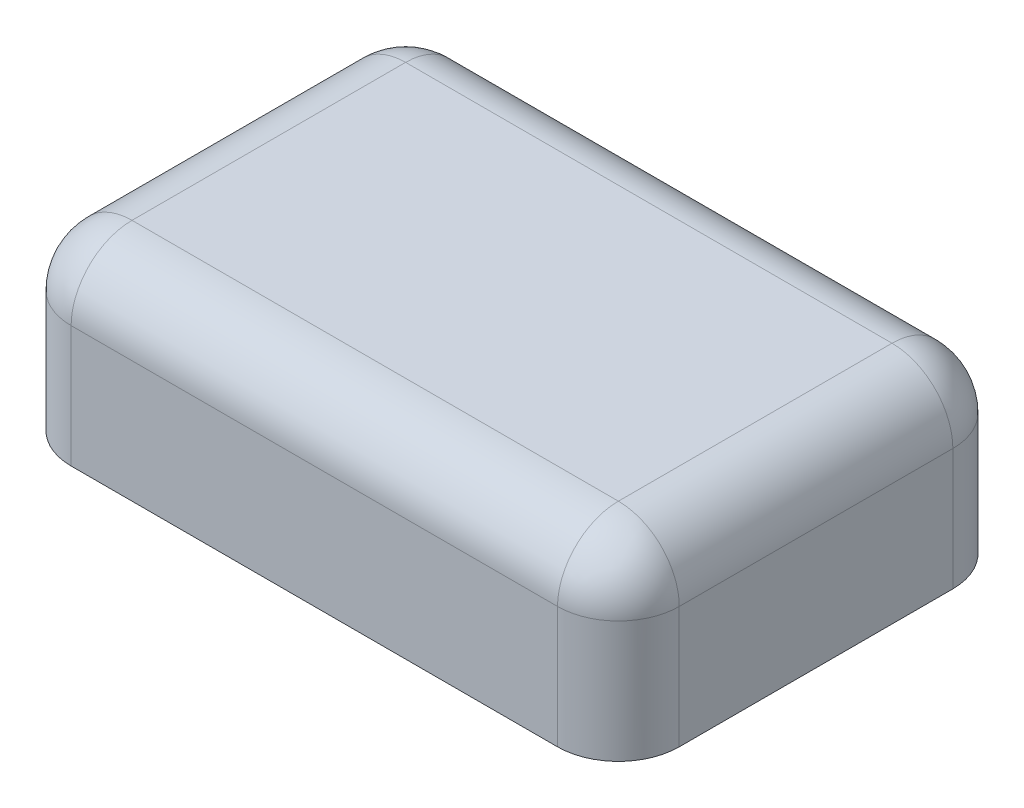
ISO-10303-21;
HEADER;
FILE_DESCRIPTION(('STEP AP214'),'2;1');
FILE_NAME('part.step','',(''),(''),'','','');
FILE_SCHEMA(('AUTOMOTIVE_DESIGN { 1 0 10303 214 1 1 1 1 }'));
ENDSEC;
DATA;
#1=APPLICATION_CONTEXT('core data for automotive mechanical design processes');
#2=APPLICATION_PROTOCOL_DEFINITION('international standard','automotive_design',2000,#1);
#3=PRODUCT_CONTEXT('',#1,'mechanical');
#4=PRODUCT('Part','Part','',(#3));
#5=PRODUCT_RELATED_PRODUCT_CATEGORY('part','',(#4));
#6=PRODUCT_DEFINITION_FORMATION('','',#4);
#7=PRODUCT_DEFINITION_CONTEXT('part definition',#1,'design');
#8=PRODUCT_DEFINITION('design','',#6,#7);
#9=PRODUCT_DEFINITION_SHAPE('','',#8);
#10=(LENGTH_UNIT() NAMED_UNIT(*) SI_UNIT(.MILLI.,.METRE.));
#11=(NAMED_UNIT(*) PLANE_ANGLE_UNIT() SI_UNIT($,.RADIAN.));
#12=(NAMED_UNIT(*) SI_UNIT($,.STERADIAN.) SOLID_ANGLE_UNIT());
#13=UNCERTAINTY_MEASURE_WITH_UNIT(LENGTH_MEASURE(1.E-05),#10,'distance_accuracy_value','');
#14=(GEOMETRIC_REPRESENTATION_CONTEXT(3) GLOBAL_UNCERTAINTY_ASSIGNED_CONTEXT((#13)) GLOBAL_UNIT_ASSIGNED_CONTEXT((#10,
#11,#12)) REPRESENTATION_CONTEXT('',''));
#15=CARTESIAN_POINT('',(0.,0.,0.));
#16=DIRECTION('',(0.,0.,1.));
#17=DIRECTION('',(1.,0.,0.));
#18=AXIS2_PLACEMENT_3D('',#15,#16,#17);
#19=CARTESIAN_POINT('',(0.,0.3,0.));
#20=DIRECTION('',(0.,1.,0.));
#21=DIRECTION('',(0.,0.,1.));
#22=AXIS2_PLACEMENT_3D('',#19,#20,#21);
#23=PLANE('',#22);
#24=DIRECTION('',(-1.,0.,0.));
#25=VECTOR('',#24,1.);
#26=CARTESIAN_POINT('',(0.553768,0.3,-0.225));
#27=LINE('',#26,#25);
#28=CARTESIAN_POINT('',(-0.4,0.3,-0.225));
#29=VERTEX_POINT('',#28);
#30=CARTESIAN_POINT('',(0.4,0.3,-0.22499999995655));
#31=VERTEX_POINT('',#30);
#32=EDGE_CURVE('E88',#29,#31,#27,.F.);
#33=ORIENTED_EDGE('',*,*,#32,.F.);
#34=DIRECTION('',(0.,0.,1.));
#35=VECTOR('',#34,1.);
#36=CARTESIAN_POINT('',(-0.4,0.3,-0.378768));
#37=LINE('',#36,#35);
#38=CARTESIAN_POINT('',(-0.4,0.3,0.22499999995655));
#39=VERTEX_POINT('',#38);
#40=EDGE_CURVE('E85',#39,#29,#37,.F.);
#41=ORIENTED_EDGE('',*,*,#40,.F.);
#42=DIRECTION('',(1.,0.,0.));
#43=VECTOR('',#42,1.);
#44=CARTESIAN_POINT('',(-0.553768,0.3,0.225));
#45=LINE('',#44,#43);
#46=CARTESIAN_POINT('',(0.39999999995655,0.3,0.225));
#47=VERTEX_POINT('',#46);
#48=EDGE_CURVE('E75',#47,#39,#45,.F.);
#49=ORIENTED_EDGE('',*,*,#48,.F.);
#50=DIRECTION('',(0.,0.,-1.));
#51=VECTOR('',#50,1.);
#52=CARTESIAN_POINT('',(0.4,0.3,0.378768));
#53=LINE('',#52,#51);
#54=EDGE_CURVE('E182',#31,#47,#53,.F.);
#55=ORIENTED_EDGE('',*,*,#54,.F.);
#56=EDGE_LOOP('',(#33,#41,#49,#55));
#57=FACE_BOUND('',#56,.T.);
#58=ADVANCED_FACE('F16',(#57),#23,.T.);
#59=CARTESIAN_POINT('',(-0.4,0.2,0.225));
#60=DIRECTION('',(-0.707106832991096,0.,0.707106729381996));
#61=DIRECTION('',(0.,1.,0.));
#62=AXIS2_PLACEMENT_3D('',#59,#60,#61);
#63=SPHERICAL_SURFACE('',#62,0.1);
#64=CARTESIAN_POINT('',(-0.4,0.2,0.225));
#65=DIRECTION('',(0.,-1.,0.));
#66=DIRECTION('',(0.,0.,-1.));
#67=AXIS2_PLACEMENT_3D('',#64,#65,#66);
#68=CIRCLE('',#67,0.1);
#69=CARTESIAN_POINT('',(-0.47071068329911,0.2,0.2957106729382));
#70=VERTEX_POINT('',#69);
#71=CARTESIAN_POINT('',(-0.5,0.2,0.22499999995655));
#72=VERTEX_POINT('',#71);
#73=EDGE_CURVE('E104',#70,#72,#68,.T.);
#74=ORIENTED_EDGE('',*,*,#73,.F.);
#75=CARTESIAN_POINT('',(-0.4,0.2,0.225));
#76=DIRECTION('',(0.,-1.,0.));
#77=DIRECTION('',(0.,0.,-1.));
#78=AXIS2_PLACEMENT_3D('',#75,#76,#77);
#79=CIRCLE('',#78,0.1);
#80=CARTESIAN_POINT('',(-0.4,0.2,0.325));
#81=VERTEX_POINT('',#80);
#82=EDGE_CURVE('E34',#81,#70,#79,.T.);
#83=ORIENTED_EDGE('',*,*,#82,.F.);
#84=CARTESIAN_POINT('',(-0.4,0.2,0.225));
#85=DIRECTION('',(1.,0.,0.));
#86=DIRECTION('',(0.,0.,-1.));
#87=AXIS2_PLACEMENT_3D('',#84,#85,#86);
#88=CIRCLE('',#87,0.1);
#89=EDGE_CURVE('E19',#39,#81,#88,.T.);
#90=ORIENTED_EDGE('',*,*,#89,.F.);
#91=CARTESIAN_POINT('',(-0.4,0.2,0.2249999999131));
#92=DIRECTION('',(0.,0.,1.));
#93=DIRECTION('',(1.,0.,0.));
#94=AXIS2_PLACEMENT_3D('',#91,#92,#93);
#95=CIRCLE('',#94,0.1);
#96=EDGE_CURVE('E92',#72,#39,#95,.F.);
#97=ORIENTED_EDGE('',*,*,#96,.F.);
#98=EDGE_LOOP('',(#74,#83,#90,#97));
#99=FACE_BOUND('',#98,.T.);
#100=ADVANCED_FACE('F102',(#99),#63,.T.);
#101=CARTESIAN_POINT('',(-0.553768,0.2,0.225));
#102=DIRECTION('',(1.,0.,0.));
#103=DIRECTION('',(0.,0.,-1.));
#104=AXIS2_PLACEMENT_3D('',#101,#102,#103);
#105=CYLINDRICAL_SURFACE('',#104,0.1);
#106=CARTESIAN_POINT('',(0.3999999999131,0.2,0.225));
#107=DIRECTION('',(1.,0.,0.));
#108=DIRECTION('',(0.,0.,-1.));
#109=AXIS2_PLACEMENT_3D('',#106,#107,#108);
#110=CIRCLE('',#109,0.1);
#111=CARTESIAN_POINT('',(0.39999999995655,0.2,0.325));
#112=VERTEX_POINT('',#111);
#113=EDGE_CURVE('E80',#47,#112,#110,.T.);
#114=ORIENTED_EDGE('',*,*,#113,.F.);
#115=ORIENTED_EDGE('',*,*,#48,.T.);
#116=ORIENTED_EDGE('',*,*,#89,.T.);
#117=DIRECTION('',(1.,0.,0.));
#118=VECTOR('',#117,1.);
#119=CARTESIAN_POINT('',(-0.5,0.2,0.325));
#120=LINE('',#119,#118);
#121=EDGE_CURVE('E109',#112,#81,#120,.F.);
#122=ORIENTED_EDGE('',*,*,#121,.F.);
#123=EDGE_LOOP('',(#114,#115,#116,#122));
#124=FACE_BOUND('',#123,.T.);
#125=ADVANCED_FACE('F77',(#124),#105,.T.);
#126=CARTESIAN_POINT('',(0.4,0.2,0.225));
#127=DIRECTION('',(0.707106729381996,0.,0.707106832991096));
#128=DIRECTION('',(0.,1.,0.));
#129=AXIS2_PLACEMENT_3D('',#126,#127,#128);
#130=SPHERICAL_SURFACE('',#129,0.1);
#131=CARTESIAN_POINT('',(0.4,0.2,0.225));
#132=DIRECTION('',(0.,-1.,0.));
#133=DIRECTION('',(0.,0.,-1.));
#134=AXIS2_PLACEMENT_3D('',#131,#132,#133);
#135=CIRCLE('',#134,0.1);
#136=CARTESIAN_POINT('',(0.4707106729382,0.2,0.29571068329911));
#137=VERTEX_POINT('',#136);
#138=EDGE_CURVE('E168',#137,#112,#135,.T.);
#139=ORIENTED_EDGE('',*,*,#138,.F.);
#140=CARTESIAN_POINT('',(0.4,0.2,0.225));
#141=DIRECTION('',(0.,-1.,0.));
#142=DIRECTION('',(0.,0.,-1.));
#143=AXIS2_PLACEMENT_3D('',#140,#141,#142);
#144=CIRCLE('',#143,0.1);
#145=CARTESIAN_POINT('',(0.5,0.2,0.225));
#146=VERTEX_POINT('',#145);
#147=EDGE_CURVE('E166',#146,#137,#144,.T.);
#148=ORIENTED_EDGE('',*,*,#147,.F.);
#149=CARTESIAN_POINT('',(0.4,0.2,0.225));
#150=DIRECTION('',(0.,0.,-1.));
#151=DIRECTION('',(-1.,0.,0.));
#152=AXIS2_PLACEMENT_3D('',#149,#150,#151);
#153=CIRCLE('',#152,0.1);
#154=EDGE_CURVE('E184',#47,#146,#153,.T.);
#155=ORIENTED_EDGE('',*,*,#154,.F.);
#156=ORIENTED_EDGE('',*,*,#113,.T.);
#157=EDGE_LOOP('',(#139,#148,#155,#156));
#158=FACE_BOUND('',#157,.T.);
#159=ADVANCED_FACE('F171',(#158),#130,.T.);
#160=CARTESIAN_POINT('',(0.4,0.2,0.378768));
#161=DIRECTION('',(0.,0.,-1.));
#162=DIRECTION('',(-1.,0.,0.));
#163=AXIS2_PLACEMENT_3D('',#160,#161,#162);
#164=CYLINDRICAL_SURFACE('',#163,0.1);
#165=CARTESIAN_POINT('',(0.4,0.2,-0.2249999999131));
#166=DIRECTION('',(0.,0.,-1.));
#167=DIRECTION('',(-1.,0.,0.));
#168=AXIS2_PLACEMENT_3D('',#165,#166,#167);
#169=CIRCLE('',#168,0.1);
#170=CARTESIAN_POINT('',(0.5,0.2,-0.22499999995655));
#171=VERTEX_POINT('',#170);
#172=EDGE_CURVE('E183',#31,#171,#169,.T.);
#173=ORIENTED_EDGE('',*,*,#172,.F.);
#174=ORIENTED_EDGE('',*,*,#54,.T.);
#175=ORIENTED_EDGE('',*,*,#154,.T.);
#176=DIRECTION('',(0.,0.,-1.));
#177=VECTOR('',#176,1.);
#178=CARTESIAN_POINT('',(0.5,0.2,0.325));
#179=LINE('',#178,#177);
#180=EDGE_CURVE('E161',#171,#146,#179,.F.);
#181=ORIENTED_EDGE('',*,*,#180,.F.);
#182=EDGE_LOOP('',(#173,#174,#175,#181));
#183=FACE_BOUND('',#182,.T.);
#184=ADVANCED_FACE('F155',(#183),#164,.T.);
#185=CARTESIAN_POINT('',(0.4,0.2,-0.225));
#186=DIRECTION('',(0.707106832991096,0.,-0.707106729381996));
#187=DIRECTION('',(0.,1.,0.));
#188=AXIS2_PLACEMENT_3D('',#185,#186,#187);
#189=SPHERICAL_SURFACE('',#188,0.1);
#190=CARTESIAN_POINT('',(0.4,0.2,-0.225));
#191=DIRECTION('',(0.,-1.,0.));
#192=DIRECTION('',(0.,0.,-1.));
#193=AXIS2_PLACEMENT_3D('',#190,#191,#192);
#194=CIRCLE('',#193,0.1);
#195=CARTESIAN_POINT('',(0.47071068329911,0.2,-0.2957106729382));
#196=VERTEX_POINT('',#195);
#197=EDGE_CURVE('E201',#196,#171,#194,.T.);
#198=ORIENTED_EDGE('',*,*,#197,.F.);
#199=CARTESIAN_POINT('',(0.4,0.2,-0.225));
#200=DIRECTION('',(0.,-1.,0.));
#201=DIRECTION('',(0.,0.,-1.));
#202=AXIS2_PLACEMENT_3D('',#199,#200,#201);
#203=CIRCLE('',#202,0.1);
#204=CARTESIAN_POINT('',(0.4,0.2,-0.325));
#205=VERTEX_POINT('',#204);
#206=EDGE_CURVE('E160',#205,#196,#203,.T.);
#207=ORIENTED_EDGE('',*,*,#206,.F.);
#208=CARTESIAN_POINT('',(0.4,0.2,-0.225));
#209=DIRECTION('',(-1.,0.,0.));
#210=DIRECTION('',(0.,0.,1.));
#211=AXIS2_PLACEMENT_3D('',#208,#209,#210);
#212=CIRCLE('',#211,0.1);
#213=EDGE_CURVE('E181',#31,#205,#212,.T.);
#214=ORIENTED_EDGE('',*,*,#213,.F.);
#215=ORIENTED_EDGE('',*,*,#172,.T.);
#216=EDGE_LOOP('',(#198,#207,#214,#215));
#217=FACE_BOUND('',#216,.T.);
#218=ADVANCED_FACE('F150',(#217),#189,.T.);
#219=CARTESIAN_POINT('',(0.553768,0.2,-0.225));
#220=DIRECTION('',(-1.,0.,0.));
#221=DIRECTION('',(0.,0.,1.));
#222=AXIS2_PLACEMENT_3D('',#219,#220,#221);
#223=CYLINDRICAL_SURFACE('',#222,0.1);
#224=CARTESIAN_POINT('',(-0.4,0.2,-0.225));
#225=DIRECTION('',(-1.,0.,0.));
#226=DIRECTION('',(0.,0.,1.));
#227=AXIS2_PLACEMENT_3D('',#224,#225,#226);
#228=CIRCLE('',#227,0.1);
#229=CARTESIAN_POINT('',(-0.4,0.2,-0.325));
#230=VERTEX_POINT('',#229);
#231=EDGE_CURVE('E180',#29,#230,#228,.T.);
#232=ORIENTED_EDGE('',*,*,#231,.F.);
#233=ORIENTED_EDGE('',*,*,#32,.T.);
#234=ORIENTED_EDGE('',*,*,#213,.T.);
#235=DIRECTION('',(-1.,0.,0.));
#236=VECTOR('',#235,1.);
#237=CARTESIAN_POINT('',(0.5,0.2,-0.325));
#238=LINE('',#237,#236);
#239=EDGE_CURVE('E138',#230,#205,#238,.F.);
#240=ORIENTED_EDGE('',*,*,#239,.F.);
#241=EDGE_LOOP('',(#232,#233,#234,#240));
#242=FACE_BOUND('',#241,.T.);
#243=ADVANCED_FACE('F145',(#242),#223,.T.);
#244=CARTESIAN_POINT('',(-0.4,0.2,-0.225));
#245=DIRECTION('',(-0.707106729381996,0.,-0.707106832991096));
#246=DIRECTION('',(0.,1.,0.));
#247=AXIS2_PLACEMENT_3D('',#244,#245,#246);
#248=SPHERICAL_SURFACE('',#247,0.1);
#249=CARTESIAN_POINT('',(-0.4,0.2,-0.225));
#250=DIRECTION('',(0.,-1.,0.));
#251=DIRECTION('',(0.,0.,-1.));
#252=AXIS2_PLACEMENT_3D('',#249,#250,#251);
#253=CIRCLE('',#252,0.1);
#254=CARTESIAN_POINT('',(-0.4707106729382,0.2,-0.29571068329911));
#255=VERTEX_POINT('',#254);
#256=EDGE_CURVE('E134',#255,#230,#253,.T.);
#257=ORIENTED_EDGE('',*,*,#256,.F.);
#258=CARTESIAN_POINT('',(-0.4,0.2,-0.225));
#259=DIRECTION('',(0.,-1.,0.));
#260=DIRECTION('',(0.,0.,-1.));
#261=AXIS2_PLACEMENT_3D('',#258,#259,#260);
#262=CIRCLE('',#261,0.1);
#263=CARTESIAN_POINT('',(-0.5,0.2,-0.225));
#264=VERTEX_POINT('',#263);
#265=EDGE_CURVE('E131',#264,#255,#262,.T.);
#266=ORIENTED_EDGE('',*,*,#265,.F.);
#267=CARTESIAN_POINT('',(-0.4,0.2,-0.225));
#268=DIRECTION('',(0.,0.,1.));
#269=DIRECTION('',(1.,0.,0.));
#270=AXIS2_PLACEMENT_3D('',#267,#268,#269);
#271=CIRCLE('',#270,0.1);
#272=EDGE_CURVE('E100',#29,#264,#271,.T.);
#273=ORIENTED_EDGE('',*,*,#272,.F.);
#274=ORIENTED_EDGE('',*,*,#231,.T.);
#275=EDGE_LOOP('',(#257,#266,#273,#274));
#276=FACE_BOUND('',#275,.T.);
#277=ADVANCED_FACE('F141',(#276),#248,.T.);
#278=CARTESIAN_POINT('',(-0.4,0.2,-0.378768));
#279=DIRECTION('',(0.,0.,1.));
#280=DIRECTION('',(1.,0.,0.));
#281=AXIS2_PLACEMENT_3D('',#278,#279,#280);
#282=CYLINDRICAL_SURFACE('',#281,0.1);
#283=ORIENTED_EDGE('',*,*,#96,.T.);
#284=ORIENTED_EDGE('',*,*,#40,.T.);
#285=ORIENTED_EDGE('',*,*,#272,.T.);
#286=DIRECTION('',(0.,0.,1.));
#287=VECTOR('',#286,1.);
#288=CARTESIAN_POINT('',(-0.5,0.2,-0.325));
#289=LINE('',#288,#287);
#290=EDGE_CURVE('E98',#72,#264,#289,.F.);
#291=ORIENTED_EDGE('',*,*,#290,.F.);
#292=EDGE_LOOP('',(#283,#284,#285,#291));
#293=FACE_BOUND('',#292,.T.);
#294=ADVANCED_FACE('F96',(#293),#282,.T.);
#295=CARTESIAN_POINT('',(-0.4,0.69108,0.225));
#296=DIRECTION('',(0.,-1.,0.));
#297=DIRECTION('',(0.,0.,-1.));
#298=AXIS2_PLACEMENT_3D('',#295,#296,#297);
#299=CYLINDRICAL_SURFACE('',#298,0.1);
#300=DIRECTION('',(0.,1.,0.));
#301=VECTOR('',#300,1.);
#302=CARTESIAN_POINT('',(-0.4,0.,0.325));
#303=LINE('',#302,#301);
#304=CARTESIAN_POINT('',(-0.4,0.,0.325));
#305=VERTEX_POINT('',#304);
#306=EDGE_CURVE('E113',#81,#305,#303,.F.);
#307=ORIENTED_EDGE('',*,*,#306,.F.);
#308=ORIENTED_EDGE('',*,*,#82,.T.);
#309=ORIENTED_EDGE('',*,*,#73,.T.);
#310=DIRECTION('',(0.,1.,0.));
#311=VECTOR('',#310,1.);
#312=CARTESIAN_POINT('',(-0.5,0.,0.225));
#313=LINE('',#312,#311);
#314=CARTESIAN_POINT('',(-0.5,0.,0.225));
#315=VERTEX_POINT('',#314);
#316=EDGE_CURVE('E130',#315,#72,#313,.T.);
#317=ORIENTED_EDGE('',*,*,#316,.F.);
#318=CARTESIAN_POINT('',(-0.4,0.,0.225));
#319=DIRECTION('',(0.,-1.,0.));
#320=DIRECTION('',(0.,0.,-1.));
#321=AXIS2_PLACEMENT_3D('',#318,#319,#320);
#322=CIRCLE('',#321,0.1);
#323=EDGE_CURVE('E123',#315,#305,#322,.F.);
#324=ORIENTED_EDGE('',*,*,#323,.T.);
#325=EDGE_LOOP('',(#307,#308,#309,#317,#324));
#326=FACE_BOUND('',#325,.T.);
#327=ADVANCED_FACE('F120',(#326),#299,.T.);
#328=CARTESIAN_POINT('',(-0.5,0.,0.325));
#329=DIRECTION('',(0.,0.,1.));
#330=DIRECTION('',(1.,0.,0.));
#331=AXIS2_PLACEMENT_3D('',#328,#329,#330);
#332=PLANE('',#331);
#333=DIRECTION('',(0.,-1.,0.));
#334=VECTOR('',#333,1.);
#335=CARTESIAN_POINT('',(0.3999999999131,0.69108,0.325));
#336=LINE('',#335,#334);
#337=CARTESIAN_POINT('',(0.39999999995655,0.,0.325));
#338=VERTEX_POINT('',#337);
#339=EDGE_CURVE('E116',#112,#338,#336,.T.);
#340=ORIENTED_EDGE('',*,*,#339,.F.);
#341=ORIENTED_EDGE('',*,*,#121,.T.);
#342=ORIENTED_EDGE('',*,*,#306,.T.);
#343=DIRECTION('',(1.,0.,0.));
#344=VECTOR('',#343,1.);
#345=CARTESIAN_POINT('',(0.,0.,0.325));
#346=LINE('',#345,#344);
#347=EDGE_CURVE('E196',#305,#338,#346,.T.);
#348=ORIENTED_EDGE('',*,*,#347,.T.);
#349=EDGE_LOOP('',(#340,#341,#342,#348));
#350=FACE_BOUND('',#349,.T.);
#351=ADVANCED_FACE('F110',(#350),#332,.T.);
#352=CARTESIAN_POINT('',(0.4,0.69108,0.225));
#353=DIRECTION('',(0.,-1.,0.));
#354=DIRECTION('',(0.,0.,-1.));
#355=AXIS2_PLACEMENT_3D('',#352,#353,#354);
#356=CYLINDRICAL_SURFACE('',#355,0.1);
#357=DIRECTION('',(0.,1.,0.));
#358=VECTOR('',#357,1.);
#359=CARTESIAN_POINT('',(0.5,0.,0.225));
#360=LINE('',#359,#358);
#361=CARTESIAN_POINT('',(0.5,0.,0.225));
#362=VERTEX_POINT('',#361);
#363=EDGE_CURVE('E165',#146,#362,#360,.F.);
#364=ORIENTED_EDGE('',*,*,#363,.F.);
#365=ORIENTED_EDGE('',*,*,#147,.T.);
#366=ORIENTED_EDGE('',*,*,#138,.T.);
#367=ORIENTED_EDGE('',*,*,#339,.T.);
#368=CARTESIAN_POINT('',(0.4,0.,0.225));
#369=DIRECTION('',(0.,-1.,0.));
#370=DIRECTION('',(0.,0.,-1.));
#371=AXIS2_PLACEMENT_3D('',#368,#369,#370);
#372=CIRCLE('',#371,0.1);
#373=EDGE_CURVE('E193',#338,#362,#372,.F.);
#374=ORIENTED_EDGE('',*,*,#373,.T.);
#375=EDGE_LOOP('',(#364,#365,#366,#367,#374));
#376=FACE_BOUND('',#375,.T.);
#377=ADVANCED_FACE('F256',(#376),#356,.T.);
#378=CARTESIAN_POINT('',(0.5,0.,0.325));
#379=DIRECTION('',(1.,0.,0.));
#380=DIRECTION('',(0.,0.,-1.));
#381=AXIS2_PLACEMENT_3D('',#378,#379,#380);
#382=PLANE('',#381);
#383=DIRECTION('',(0.,-1.,0.));
#384=VECTOR('',#383,1.);
#385=CARTESIAN_POINT('',(0.5,0.69108,-0.2249999999131));
#386=LINE('',#385,#384);
#387=CARTESIAN_POINT('',(0.5,0.,-0.22499999995655));
#388=VERTEX_POINT('',#387);
#389=EDGE_CURVE('E164',#171,#388,#386,.T.);
#390=ORIENTED_EDGE('',*,*,#389,.F.);
#391=ORIENTED_EDGE('',*,*,#180,.T.);
#392=ORIENTED_EDGE('',*,*,#363,.T.);
#393=DIRECTION('',(0.,0.,1.));
#394=VECTOR('',#393,1.);
#395=CARTESIAN_POINT('',(0.5,0.,0.));
#396=LINE('',#395,#394);
#397=EDGE_CURVE('E192',#362,#388,#396,.F.);
#398=ORIENTED_EDGE('',*,*,#397,.T.);
#399=EDGE_LOOP('',(#390,#391,#392,#398));
#400=FACE_BOUND('',#399,.T.);
#401=ADVANCED_FACE('F246',(#400),#382,.T.);
#402=CARTESIAN_POINT('',(0.4,0.69108,-0.225));
#403=DIRECTION('',(0.,-1.,0.));
#404=DIRECTION('',(0.,0.,-1.));
#405=AXIS2_PLACEMENT_3D('',#402,#403,#404);
#406=CYLINDRICAL_SURFACE('',#405,0.1);
#407=DIRECTION('',(0.,1.,0.));
#408=VECTOR('',#407,1.);
#409=CARTESIAN_POINT('',(0.4,0.,-0.325));
#410=LINE('',#409,#408);
#411=CARTESIAN_POINT('',(0.4,0.,-0.325));
#412=VERTEX_POINT('',#411);
#413=EDGE_CURVE('E204',#205,#412,#410,.F.);
#414=ORIENTED_EDGE('',*,*,#413,.F.);
#415=ORIENTED_EDGE('',*,*,#206,.T.);
#416=ORIENTED_EDGE('',*,*,#197,.T.);
#417=ORIENTED_EDGE('',*,*,#389,.T.);
#418=CARTESIAN_POINT('',(0.4,0.,-0.225));
#419=DIRECTION('',(0.,-1.,0.));
#420=DIRECTION('',(0.,0.,-1.));
#421=AXIS2_PLACEMENT_3D('',#418,#419,#420);
#422=CIRCLE('',#421,0.1);
#423=EDGE_CURVE('E189',#388,#412,#422,.F.);
#424=ORIENTED_EDGE('',*,*,#423,.T.);
#425=EDGE_LOOP('',(#414,#415,#416,#417,#424));
#426=FACE_BOUND('',#425,.T.);
#427=ADVANCED_FACE('F232',(#426),#406,.T.);
#428=CARTESIAN_POINT('',(0.5,0.,-0.325));
#429=DIRECTION('',(0.,0.,-1.));
#430=DIRECTION('',(-1.,0.,0.));
#431=AXIS2_PLACEMENT_3D('',#428,#429,#430);
#432=PLANE('',#431);
#433=DIRECTION('',(0.,-1.,0.));
#434=VECTOR('',#433,1.);
#435=CARTESIAN_POINT('',(-0.4,0.69108,-0.325));
#436=LINE('',#435,#434);
#437=CARTESIAN_POINT('',(-0.4,0.,-0.325));
#438=VERTEX_POINT('',#437);
#439=EDGE_CURVE('E135',#230,#438,#436,.T.);
#440=ORIENTED_EDGE('',*,*,#439,.F.);
#441=ORIENTED_EDGE('',*,*,#239,.T.);
#442=ORIENTED_EDGE('',*,*,#413,.T.);
#443=DIRECTION('',(1.,0.,0.));
#444=VECTOR('',#443,1.);
#445=CARTESIAN_POINT('',(0.,0.,-0.325));
#446=LINE('',#445,#444);
#447=EDGE_CURVE('E188',#412,#438,#446,.F.);
#448=ORIENTED_EDGE('',*,*,#447,.T.);
#449=EDGE_LOOP('',(#440,#441,#442,#448));
#450=FACE_BOUND('',#449,.T.);
#451=ADVANCED_FACE('F227',(#450),#432,.T.);
#452=CARTESIAN_POINT('',(-0.4,0.69108,-0.225));
#453=DIRECTION('',(0.,-1.,0.));
#454=DIRECTION('',(0.,0.,-1.));
#455=AXIS2_PLACEMENT_3D('',#452,#453,#454);
#456=CYLINDRICAL_SURFACE('',#455,0.1);
#457=DIRECTION('',(0.,1.,0.));
#458=VECTOR('',#457,1.);
#459=CARTESIAN_POINT('',(-0.5,0.,-0.225));
#460=LINE('',#459,#458);
#461=CARTESIAN_POINT('',(-0.5,0.,-0.225));
#462=VERTEX_POINT('',#461);
#463=EDGE_CURVE('E200',#264,#462,#460,.F.);
#464=ORIENTED_EDGE('',*,*,#463,.F.);
#465=ORIENTED_EDGE('',*,*,#265,.T.);
#466=ORIENTED_EDGE('',*,*,#256,.T.);
#467=ORIENTED_EDGE('',*,*,#439,.T.);
#468=CARTESIAN_POINT('',(-0.4,0.,-0.225));
#469=DIRECTION('',(0.,-1.,0.));
#470=DIRECTION('',(0.,0.,-1.));
#471=AXIS2_PLACEMENT_3D('',#468,#469,#470);
#472=CIRCLE('',#471,0.1);
#473=EDGE_CURVE('E25',#438,#462,#472,.F.);
#474=ORIENTED_EDGE('',*,*,#473,.T.);
#475=EDGE_LOOP('',(#464,#465,#466,#467,#474));
#476=FACE_BOUND('',#475,.T.);
#477=ADVANCED_FACE('F275',(#476),#456,.T.);
#478=CARTESIAN_POINT('',(-0.5,0.,-0.325));
#479=DIRECTION('',(-1.,0.,0.));
#480=DIRECTION('',(0.,0.,1.));
#481=AXIS2_PLACEMENT_3D('',#478,#479,#480);
#482=PLANE('',#481);
#483=ORIENTED_EDGE('',*,*,#316,.T.);
#484=ORIENTED_EDGE('',*,*,#290,.T.);
#485=ORIENTED_EDGE('',*,*,#463,.T.);
#486=DIRECTION('',(0.,0.,1.));
#487=VECTOR('',#486,1.);
#488=CARTESIAN_POINT('',(-0.5,0.,0.));
#489=LINE('',#488,#487);
#490=EDGE_CURVE('E10',#462,#315,#489,.T.);
#491=ORIENTED_EDGE('',*,*,#490,.T.);
#492=EDGE_LOOP('',(#483,#484,#485,#491));
#493=FACE_BOUND('',#492,.T.);
#494=ADVANCED_FACE('F280',(#493),#482,.T.);
#495=CARTESIAN_POINT('',(0.,0.,0.));
#496=DIRECTION('',(0.,1.,0.));
#497=DIRECTION('',(0.,0.,1.));
#498=AXIS2_PLACEMENT_3D('',#495,#496,#497);
#499=PLANE('',#498);
#500=ORIENTED_EDGE('',*,*,#473,.F.);
#501=ORIENTED_EDGE('',*,*,#447,.F.);
#502=ORIENTED_EDGE('',*,*,#423,.F.);
#503=ORIENTED_EDGE('',*,*,#397,.F.);
#504=ORIENTED_EDGE('',*,*,#373,.F.);
#505=ORIENTED_EDGE('',*,*,#347,.F.);
#506=ORIENTED_EDGE('',*,*,#323,.F.);
#507=ORIENTED_EDGE('',*,*,#490,.F.);
#508=EDGE_LOOP('',(#500,#501,#502,#503,#504,#505,#506,#507));
#509=FACE_BOUND('',#508,.T.);
#510=ADVANCED_FACE('F254',(#509),#499,.F.);
#511=CLOSED_SHELL('',(#58,#100,#125,#159,#184,#218,#243,#277,#294,#327,#351,#377,#401,#427,#451,
#477,#494,#510));
#512=MANIFOLD_SOLID_BREP('B1',#511);
#513=ADVANCED_BREP_SHAPE_REPRESENTATION('',(#18,#512),#14);
#514=SHAPE_DEFINITION_REPRESENTATION(#9,#513);
ENDSEC;
END-ISO-10303-21;
